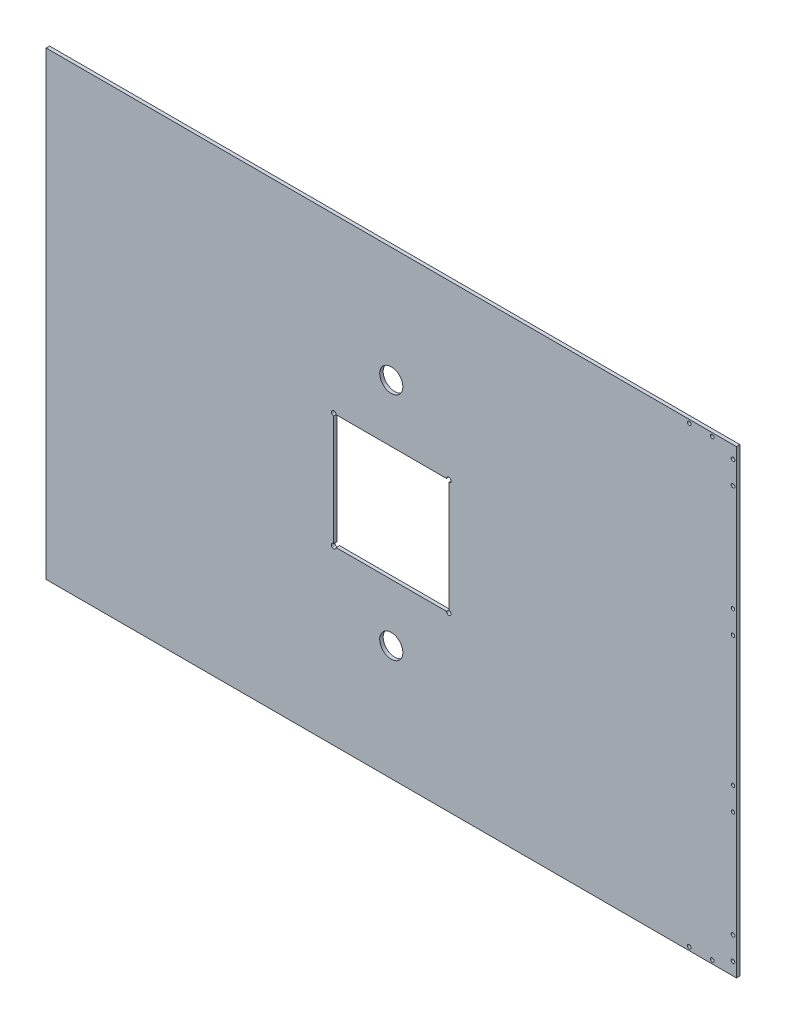
ISO-10303-21;
HEADER;
FILE_DESCRIPTION(('STEP AP214'),'2;1');
FILE_NAME('part.step','',(''),(''),'','','');
FILE_SCHEMA(('AUTOMOTIVE_DESIGN { 1 0 10303 214 1 1 1 1 }'));
ENDSEC;
DATA;
#1=APPLICATION_CONTEXT('core data for automotive mechanical design processes');
#2=APPLICATION_PROTOCOL_DEFINITION('international standard','automotive_design',2000,#1);
#3=PRODUCT_CONTEXT('',#1,'mechanical');
#4=PRODUCT('Part','Part','',(#3));
#5=PRODUCT_RELATED_PRODUCT_CATEGORY('part','',(#4));
#6=PRODUCT_DEFINITION_FORMATION('','',#4);
#7=PRODUCT_DEFINITION_CONTEXT('part definition',#1,'design');
#8=PRODUCT_DEFINITION('design','',#6,#7);
#9=PRODUCT_DEFINITION_SHAPE('','',#8);
#10=(LENGTH_UNIT() NAMED_UNIT(*) SI_UNIT(.MILLI.,.METRE.));
#11=(NAMED_UNIT(*) PLANE_ANGLE_UNIT() SI_UNIT($,.RADIAN.));
#12=(NAMED_UNIT(*) SI_UNIT($,.STERADIAN.) SOLID_ANGLE_UNIT());
#13=UNCERTAINTY_MEASURE_WITH_UNIT(LENGTH_MEASURE(1.E-05),#10,'distance_accuracy_value','');
#14=(GEOMETRIC_REPRESENTATION_CONTEXT(3) GLOBAL_UNCERTAINTY_ASSIGNED_CONTEXT((#13)) GLOBAL_UNIT_ASSIGNED_CONTEXT((#10,
#11,#12)) REPRESENTATION_CONTEXT('',''));
#15=CARTESIAN_POINT('',(0.,0.,0.));
#16=DIRECTION('',(0.,0.,1.));
#17=DIRECTION('',(1.,0.,0.));
#18=AXIS2_PLACEMENT_3D('',#15,#16,#17);
#19=CARTESIAN_POINT('',(300.,200.,3.));
#20=DIRECTION('',(-1.,0.,0.));
#21=DIRECTION('',(0.,0.,1.));
#22=AXIS2_PLACEMENT_3D('',#19,#20,#21);
#23=PLANE('',#22);
#24=DIRECTION('',(0.,1.,0.));
#25=VECTOR('',#24,1.);
#26=CARTESIAN_POINT('',(300.,200.,0.));
#27=LINE('',#26,#25);
#28=CARTESIAN_POINT('',(300.,-200.,0.));
#29=VERTEX_POINT('',#28);
#30=CARTESIAN_POINT('',(300.,200.,0.));
#31=VERTEX_POINT('',#30);
#32=EDGE_CURVE('E181',#29,#31,#27,.T.);
#33=ORIENTED_EDGE('',*,*,#32,.T.);
#34=DIRECTION('',(0.,0.,-1.));
#35=VECTOR('',#34,1.);
#36=CARTESIAN_POINT('',(300.,200.,3.));
#37=LINE('',#36,#35);
#38=CARTESIAN_POINT('',(300.,200.,3.));
#39=VERTEX_POINT('',#38);
#40=EDGE_CURVE('E199',#39,#31,#37,.T.);
#41=ORIENTED_EDGE('',*,*,#40,.F.);
#42=DIRECTION('',(0.,1.,0.));
#43=VECTOR('',#42,1.);
#44=CARTESIAN_POINT('',(300.,200.,3.));
#45=LINE('',#44,#43);
#46=CARTESIAN_POINT('',(300.,-200.,3.));
#47=VERTEX_POINT('',#46);
#48=EDGE_CURVE('E167',#47,#39,#45,.T.);
#49=ORIENTED_EDGE('',*,*,#48,.F.);
#50=DIRECTION('',(0.,0.,-1.));
#51=VECTOR('',#50,1.);
#52=CARTESIAN_POINT('',(300.,-200.,3.));
#53=LINE('',#52,#51);
#54=EDGE_CURVE('E179',#47,#29,#53,.T.);
#55=ORIENTED_EDGE('',*,*,#54,.T.);
#56=EDGE_LOOP('',(#33,#41,#49,#55));
#57=FACE_BOUND('',#56,.T.);
#58=ADVANCED_FACE('F41',(#57),#23,.F.);
#59=CARTESIAN_POINT('',(-300.,200.,3.));
#60=DIRECTION('',(0.,-1.,0.));
#61=DIRECTION('',(0.,0.,-1.));
#62=AXIS2_PLACEMENT_3D('',#59,#60,#61);
#63=PLANE('',#62);
#64=DIRECTION('',(-1.,0.,0.));
#65=VECTOR('',#64,1.);
#66=CARTESIAN_POINT('',(-300.,200.,0.));
#67=LINE('',#66,#65);
#68=CARTESIAN_POINT('',(-300.,200.,0.));
#69=VERTEX_POINT('',#68);
#70=EDGE_CURVE('E183',#31,#69,#67,.T.);
#71=ORIENTED_EDGE('',*,*,#70,.T.);
#72=DIRECTION('',(0.,0.,-1.));
#73=VECTOR('',#72,1.);
#74=CARTESIAN_POINT('',(-300.,200.,3.));
#75=LINE('',#74,#73);
#76=CARTESIAN_POINT('',(-300.,200.,3.));
#77=VERTEX_POINT('',#76);
#78=EDGE_CURVE('E191',#77,#69,#75,.T.);
#79=ORIENTED_EDGE('',*,*,#78,.F.);
#80=DIRECTION('',(-1.,0.,0.));
#81=VECTOR('',#80,1.);
#82=CARTESIAN_POINT('',(-300.,200.,3.));
#83=LINE('',#82,#81);
#84=EDGE_CURVE('E173',#39,#77,#83,.T.);
#85=ORIENTED_EDGE('',*,*,#84,.F.);
#86=ORIENTED_EDGE('',*,*,#40,.T.);
#87=EDGE_LOOP('',(#71,#79,#85,#86));
#88=FACE_BOUND('',#87,.T.);
#89=ADVANCED_FACE('F380',(#88),#63,.F.);
#90=CARTESIAN_POINT('',(-300.,200.,3.));
#91=DIRECTION('',(1.,0.,0.));
#92=DIRECTION('',(0.,1.,0.));
#93=AXIS2_PLACEMENT_3D('',#90,#91,#92);
#94=PLANE('',#93);
#95=DIRECTION('',(0.,-1.,0.));
#96=VECTOR('',#95,1.);
#97=CARTESIAN_POINT('',(-300.,200.,0.));
#98=LINE('',#97,#96);
#99=CARTESIAN_POINT('',(-300.,-200.,0.));
#100=VERTEX_POINT('',#99);
#101=EDGE_CURVE('E187',#69,#100,#98,.T.);
#102=ORIENTED_EDGE('',*,*,#101,.T.);
#103=DIRECTION('',(0.,0.,-1.));
#104=VECTOR('',#103,1.);
#105=CARTESIAN_POINT('',(-300.,-200.,3.));
#106=LINE('',#105,#104);
#107=CARTESIAN_POINT('',(-300.,-200.,3.));
#108=VERTEX_POINT('',#107);
#109=EDGE_CURVE('E192',#108,#100,#106,.T.);
#110=ORIENTED_EDGE('',*,*,#109,.F.);
#111=DIRECTION('',(0.,-1.,0.));
#112=VECTOR('',#111,1.);
#113=CARTESIAN_POINT('',(-300.,200.,3.));
#114=LINE('',#113,#112);
#115=EDGE_CURVE('E176',#77,#108,#114,.T.);
#116=ORIENTED_EDGE('',*,*,#115,.F.);
#117=ORIENTED_EDGE('',*,*,#78,.T.);
#118=EDGE_LOOP('',(#102,#110,#116,#117));
#119=FACE_BOUND('',#118,.T.);
#120=ADVANCED_FACE('F385',(#119),#94,.F.);
#121=CARTESIAN_POINT('',(-300.,-200.,3.));
#122=DIRECTION('',(0.,1.,0.));
#123=DIRECTION('',(0.,0.,1.));
#124=AXIS2_PLACEMENT_3D('',#121,#122,#123);
#125=PLANE('',#124);
#126=DIRECTION('',(1.,0.,0.));
#127=VECTOR('',#126,1.);
#128=CARTESIAN_POINT('',(-300.,-200.,0.));
#129=LINE('',#128,#127);
#130=EDGE_CURVE('E172',#100,#29,#129,.T.);
#131=ORIENTED_EDGE('',*,*,#130,.T.);
#132=ORIENTED_EDGE('',*,*,#54,.F.);
#133=DIRECTION('',(1.,0.,0.));
#134=VECTOR('',#133,1.);
#135=CARTESIAN_POINT('',(-300.,-200.,3.));
#136=LINE('',#135,#134);
#137=EDGE_CURVE('E178',#108,#47,#136,.T.);
#138=ORIENTED_EDGE('',*,*,#137,.F.);
#139=ORIENTED_EDGE('',*,*,#109,.T.);
#140=EDGE_LOOP('',(#131,#132,#138,#139));
#141=FACE_BOUND('',#140,.T.);
#142=ADVANCED_FACE('F393',(#141),#125,.F.);
#143=CARTESIAN_POINT('',(0.,0.,3.));
#144=DIRECTION('',(0.,0.,1.));
#145=DIRECTION('',(1.,0.,0.));
#146=AXIS2_PLACEMENT_3D('',#143,#144,#145);
#147=PLANE('',#146);
#148=CARTESIAN_POINT('',(297.,76.5,3.));
#149=DIRECTION('',(0.,0.,-1.));
#150=DIRECTION('',(1.,0.,0.));
#151=AXIS2_PLACEMENT_3D('',#148,#149,#150);
#152=CIRCLE('',#151,1.50000000000002);
#153=CARTESIAN_POINT('',(298.5,76.5,3.));
#154=VERTEX_POINT('',#153);
#155=EDGE_CURVE('E287',#154,#154,#152,.T.);
#156=ORIENTED_EDGE('',*,*,#155,.T.);
#157=EDGE_LOOP('',(#156));
#158=FACE_BOUND('',#157,.T.);
#159=CARTESIAN_POINT('',(297.,56.5,3.));
#160=DIRECTION('',(0.,0.,-1.));
#161=DIRECTION('',(1.,0.,0.));
#162=AXIS2_PLACEMENT_3D('',#159,#160,#161);
#163=CIRCLE('',#162,1.50000000000002);
#164=CARTESIAN_POINT('',(298.5,56.5,3.));
#165=VERTEX_POINT('',#164);
#166=EDGE_CURVE('E307',#165,#165,#163,.T.);
#167=ORIENTED_EDGE('',*,*,#166,.T.);
#168=EDGE_LOOP('',(#167));
#169=FACE_BOUND('',#168,.T.);
#170=CARTESIAN_POINT('',(297.,-56.5,3.));
#171=DIRECTION('',(0.,0.,-1.));
#172=DIRECTION('',(-1.,0.,0.));
#173=AXIS2_PLACEMENT_3D('',#170,#171,#172);
#174=CIRCLE('',#173,1.50000000000002);
#175=CARTESIAN_POINT('',(295.5,-56.5,3.));
#176=VERTEX_POINT('',#175);
#177=EDGE_CURVE('E303',#176,#176,#174,.T.);
#178=ORIENTED_EDGE('',*,*,#177,.T.);
#179=EDGE_LOOP('',(#178));
#180=FACE_BOUND('',#179,.T.);
#181=CARTESIAN_POINT('',(297.,-76.5,3.));
#182=DIRECTION('',(0.,0.,-1.));
#183=DIRECTION('',(-1.,0.,0.));
#184=AXIS2_PLACEMENT_3D('',#181,#182,#183);
#185=CIRCLE('',#184,1.50000000000002);
#186=CARTESIAN_POINT('',(295.5,-76.5,3.));
#187=VERTEX_POINT('',#186);
#188=EDGE_CURVE('E300',#187,#187,#185,.T.);
#189=ORIENTED_EDGE('',*,*,#188,.T.);
#190=EDGE_LOOP('',(#189));
#191=FACE_BOUND('',#190,.T.);
#192=CARTESIAN_POINT('',(0.,100.,3.));
#193=DIRECTION('',(0.,0.,-1.));
#194=DIRECTION('',(-1.,0.,0.));
#195=AXIS2_PLACEMENT_3D('',#192,#193,#194);
#196=CIRCLE('',#195,10.05);
#197=CARTESIAN_POINT('',(-10.05,100.,3.));
#198=VERTEX_POINT('',#197);
#199=EDGE_CURVE('E272',#198,#198,#196,.T.);
#200=ORIENTED_EDGE('',*,*,#199,.T.);
#201=EDGE_LOOP('',(#200));
#202=FACE_BOUND('',#201,.T.);
#203=CARTESIAN_POINT('',(0.,-100.,3.));
#204=DIRECTION('',(0.,0.,-1.));
#205=DIRECTION('',(1.,0.,0.));
#206=AXIS2_PLACEMENT_3D('',#203,#204,#205);
#207=CIRCLE('',#206,10.05);
#208=CARTESIAN_POINT('',(10.05,-100.,3.));
#209=VERTEX_POINT('',#208);
#210=EDGE_CURVE('E283',#209,#209,#207,.T.);
#211=ORIENTED_EDGE('',*,*,#210,.T.);
#212=EDGE_LOOP('',(#211));
#213=FACE_BOUND('',#212,.T.);
#214=CARTESIAN_POINT('',(279.,-197.,3.));
#215=DIRECTION('',(0.,0.,-1.));
#216=DIRECTION('',(1.,0.,0.));
#217=AXIS2_PLACEMENT_3D('',#214,#215,#216);
#218=CIRCLE('',#217,1.60000000000002);
#219=CARTESIAN_POINT('',(280.6,-197.,3.));
#220=VERTEX_POINT('',#219);
#221=EDGE_CURVE('E264',#220,#220,#218,.T.);
#222=ORIENTED_EDGE('',*,*,#221,.T.);
#223=EDGE_LOOP('',(#222));
#224=FACE_BOUND('',#223,.T.);
#225=CARTESIAN_POINT('',(297.,-189.,3.));
#226=DIRECTION('',(0.,0.,-1.));
#227=DIRECTION('',(1.,0.,0.));
#228=AXIS2_PLACEMENT_3D('',#225,#226,#227);
#229=CIRCLE('',#228,1.60000000000002);
#230=CARTESIAN_POINT('',(298.6,-189.,3.));
#231=VERTEX_POINT('',#230);
#232=EDGE_CURVE('E257',#231,#231,#229,.T.);
#233=ORIENTED_EDGE('',*,*,#232,.T.);
#234=EDGE_LOOP('',(#233));
#235=FACE_BOUND('',#234,.T.);
#236=CARTESIAN_POINT('',(297.,169.,3.));
#237=DIRECTION('',(0.,0.,-1.));
#238=DIRECTION('',(-1.,0.,0.));
#239=AXIS2_PLACEMENT_3D('',#236,#237,#238);
#240=CIRCLE('',#239,1.59999999999996);
#241=CARTESIAN_POINT('',(295.4,169.,3.));
#242=VERTEX_POINT('',#241);
#243=EDGE_CURVE('E249',#242,#242,#240,.T.);
#244=ORIENTED_EDGE('',*,*,#243,.T.);
#245=EDGE_LOOP('',(#244));
#246=FACE_BOUND('',#245,.T.);
#247=CARTESIAN_POINT('',(297.,189.,3.));
#248=DIRECTION('',(0.,0.,-1.));
#249=DIRECTION('',(-1.,0.,0.));
#250=AXIS2_PLACEMENT_3D('',#247,#248,#249);
#251=CIRCLE('',#250,1.60000000000002);
#252=CARTESIAN_POINT('',(295.4,189.,3.));
#253=VERTEX_POINT('',#252);
#254=EDGE_CURVE('E243',#253,#253,#251,.T.);
#255=ORIENTED_EDGE('',*,*,#254,.T.);
#256=EDGE_LOOP('',(#255));
#257=FACE_BOUND('',#256,.T.);
#258=CARTESIAN_POINT('',(279.,197.,3.));
#259=DIRECTION('',(0.,0.,-1.));
#260=DIRECTION('',(-1.,0.,0.));
#261=AXIS2_PLACEMENT_3D('',#258,#259,#260);
#262=CIRCLE('',#261,1.60000000000002);
#263=CARTESIAN_POINT('',(277.4,197.,3.));
#264=VERTEX_POINT('',#263);
#265=EDGE_CURVE('E278',#264,#264,#262,.T.);
#266=ORIENTED_EDGE('',*,*,#265,.T.);
#267=EDGE_LOOP('',(#266));
#268=FACE_BOUND('',#267,.T.);
#269=CARTESIAN_POINT('',(259.,197.,3.));
#270=DIRECTION('',(0.,0.,-1.));
#271=DIRECTION('',(-1.,0.,0.));
#272=AXIS2_PLACEMENT_3D('',#269,#270,#271);
#273=CIRCLE('',#272,1.60000000000002);
#274=CARTESIAN_POINT('',(257.4,197.,3.));
#275=VERTEX_POINT('',#274);
#276=EDGE_CURVE('E274',#275,#275,#273,.T.);
#277=ORIENTED_EDGE('',*,*,#276,.T.);
#278=EDGE_LOOP('',(#277));
#279=FACE_BOUND('',#278,.T.);
#280=CARTESIAN_POINT('',(297.,-169.,3.));
#281=DIRECTION('',(0.,0.,-1.));
#282=DIRECTION('',(1.,0.,0.));
#283=AXIS2_PLACEMENT_3D('',#280,#281,#282);
#284=CIRCLE('',#283,1.59999999999996);
#285=CARTESIAN_POINT('',(298.6,-169.,3.));
#286=VERTEX_POINT('',#285);
#287=EDGE_CURVE('E270',#286,#286,#284,.T.);
#288=ORIENTED_EDGE('',*,*,#287,.T.);
#289=EDGE_LOOP('',(#288));
#290=FACE_BOUND('',#289,.T.);
#291=CARTESIAN_POINT('',(259.,-197.,3.));
#292=DIRECTION('',(0.,0.,-1.));
#293=DIRECTION('',(1.,0.,0.));
#294=AXIS2_PLACEMENT_3D('',#291,#292,#293);
#295=CIRCLE('',#294,1.60000000000002);
#296=CARTESIAN_POINT('',(260.6,-197.,3.));
#297=VERTEX_POINT('',#296);
#298=EDGE_CURVE('E230',#297,#297,#295,.T.);
#299=ORIENTED_EDGE('',*,*,#298,.T.);
#300=EDGE_LOOP('',(#299));
#301=FACE_BOUND('',#300,.T.);
#302=CARTESIAN_POINT('',(50.,50.,3.));
#303=DIRECTION('',(0.,0.,1.));
#304=DIRECTION('',(1.,0.,0.));
#305=AXIS2_PLACEMENT_3D('',#302,#303,#304);
#306=CIRCLE('',#305,2.);
#307=CARTESIAN_POINT('',(50.,48.,3.));
#308=VERTEX_POINT('',#307);
#309=CARTESIAN_POINT('',(48.,50.,3.));
#310=VERTEX_POINT('',#309);
#311=EDGE_CURVE('E220',#308,#310,#306,.T.);
#312=ORIENTED_EDGE('',*,*,#311,.F.);
#313=DIRECTION('',(0.,-1.,0.));
#314=VECTOR('',#313,1.);
#315=CARTESIAN_POINT('',(50.,50.,3.));
#316=LINE('',#315,#314);
#317=CARTESIAN_POINT('',(50.,-48.,3.));
#318=VERTEX_POINT('',#317);
#319=EDGE_CURVE('E209',#308,#318,#316,.T.);
#320=ORIENTED_EDGE('',*,*,#319,.T.);
#321=CARTESIAN_POINT('',(50.,-50.,3.));
#322=DIRECTION('',(0.,0.,1.));
#323=DIRECTION('',(1.,0.,0.));
#324=AXIS2_PLACEMENT_3D('',#321,#322,#323);
#325=CIRCLE('',#324,2.);
#326=CARTESIAN_POINT('',(48.,-50.,3.));
#327=VERTEX_POINT('',#326);
#328=EDGE_CURVE('E65',#327,#318,#325,.T.);
#329=ORIENTED_EDGE('',*,*,#328,.F.);
#330=DIRECTION('',(-1.,0.,0.));
#331=VECTOR('',#330,1.);
#332=CARTESIAN_POINT('',(50.,-50.,3.));
#333=LINE('',#332,#331);
#334=CARTESIAN_POINT('',(-48.,-50.,3.));
#335=VERTEX_POINT('',#334);
#336=EDGE_CURVE('E163',#327,#335,#333,.T.);
#337=ORIENTED_EDGE('',*,*,#336,.T.);
#338=CARTESIAN_POINT('',(-50.,-50.,3.));
#339=DIRECTION('',(0.,0.,1.));
#340=DIRECTION('',(1.,0.,0.));
#341=AXIS2_PLACEMENT_3D('',#338,#339,#340);
#342=CIRCLE('',#341,2.);
#343=CARTESIAN_POINT('',(-50.,-48.,3.));
#344=VERTEX_POINT('',#343);
#345=EDGE_CURVE('E54',#344,#335,#342,.T.);
#346=ORIENTED_EDGE('',*,*,#345,.F.);
#347=DIRECTION('',(0.,1.,0.));
#348=VECTOR('',#347,1.);
#349=CARTESIAN_POINT('',(-50.,50.,3.));
#350=LINE('',#349,#348);
#351=CARTESIAN_POINT('',(-50.,48.,3.));
#352=VERTEX_POINT('',#351);
#353=EDGE_CURVE('E169',#344,#352,#350,.T.);
#354=ORIENTED_EDGE('',*,*,#353,.T.);
#355=CARTESIAN_POINT('',(-50.,50.,3.));
#356=DIRECTION('',(0.,0.,1.));
#357=DIRECTION('',(1.,0.,0.));
#358=AXIS2_PLACEMENT_3D('',#355,#356,#357);
#359=CIRCLE('',#358,2.);
#360=CARTESIAN_POINT('',(-48.,50.,3.));
#361=VERTEX_POINT('',#360);
#362=EDGE_CURVE('E135',#361,#352,#359,.T.);
#363=ORIENTED_EDGE('',*,*,#362,.F.);
#364=DIRECTION('',(1.,0.,0.));
#365=VECTOR('',#364,1.);
#366=CARTESIAN_POINT('',(50.,50.,3.));
#367=LINE('',#366,#365);
#368=EDGE_CURVE('E216',#361,#310,#367,.T.);
#369=ORIENTED_EDGE('',*,*,#368,.T.);
#370=EDGE_LOOP('',(#312,#320,#329,#337,#346,#354,#363,#369));
#371=FACE_BOUND('',#370,.T.);
#372=ORIENTED_EDGE('',*,*,#48,.T.);
#373=ORIENTED_EDGE('',*,*,#84,.T.);
#374=ORIENTED_EDGE('',*,*,#115,.T.);
#375=ORIENTED_EDGE('',*,*,#137,.T.);
#376=EDGE_LOOP('',(#372,#373,#374,#375));
#377=FACE_BOUND('',#376,.T.);
#378=ADVANCED_FACE('F214',(#158,#169,#180,#191,#202,#213,#224,#235,#246,#257,#268,#279,#290,
#301,#371,#377),#147,.T.);
#379=CARTESIAN_POINT('',(0.,0.,0.));
#380=DIRECTION('',(0.,0.,1.));
#381=DIRECTION('',(1.,0.,0.));
#382=AXIS2_PLACEMENT_3D('',#379,#380,#381);
#383=PLANE('',#382);
#384=CARTESIAN_POINT('',(297.,76.5,0.));
#385=DIRECTION('',(0.,0.,-1.));
#386=DIRECTION('',(1.,0.,0.));
#387=AXIS2_PLACEMENT_3D('',#384,#385,#386);
#388=CIRCLE('',#387,1.50000000000002);
#389=CARTESIAN_POINT('',(298.5,76.5,0.));
#390=VERTEX_POINT('',#389);
#391=EDGE_CURVE('E314',#390,#390,#388,.T.);
#392=ORIENTED_EDGE('',*,*,#391,.F.);
#393=EDGE_LOOP('',(#392));
#394=FACE_BOUND('',#393,.T.);
#395=CARTESIAN_POINT('',(297.,56.5,0.));
#396=DIRECTION('',(0.,0.,-1.));
#397=DIRECTION('',(1.,0.,0.));
#398=AXIS2_PLACEMENT_3D('',#395,#396,#397);
#399=CIRCLE('',#398,1.50000000000002);
#400=CARTESIAN_POINT('',(298.5,56.5,0.));
#401=VERTEX_POINT('',#400);
#402=EDGE_CURVE('E315',#401,#401,#399,.T.);
#403=ORIENTED_EDGE('',*,*,#402,.F.);
#404=EDGE_LOOP('',(#403));
#405=FACE_BOUND('',#404,.T.);
#406=CARTESIAN_POINT('',(297.,-56.5,0.));
#407=DIRECTION('',(0.,0.,-1.));
#408=DIRECTION('',(-1.,0.,0.));
#409=AXIS2_PLACEMENT_3D('',#406,#407,#408);
#410=CIRCLE('',#409,1.50000000000002);
#411=CARTESIAN_POINT('',(295.5,-56.5,0.));
#412=VERTEX_POINT('',#411);
#413=EDGE_CURVE('E306',#412,#412,#410,.T.);
#414=ORIENTED_EDGE('',*,*,#413,.F.);
#415=EDGE_LOOP('',(#414));
#416=FACE_BOUND('',#415,.T.);
#417=CARTESIAN_POINT('',(297.,-76.5,0.));
#418=DIRECTION('',(0.,0.,-1.));
#419=DIRECTION('',(-1.,0.,0.));
#420=AXIS2_PLACEMENT_3D('',#417,#418,#419);
#421=CIRCLE('',#420,1.50000000000002);
#422=CARTESIAN_POINT('',(295.5,-76.5,0.));
#423=VERTEX_POINT('',#422);
#424=EDGE_CURVE('E297',#423,#423,#421,.T.);
#425=ORIENTED_EDGE('',*,*,#424,.F.);
#426=EDGE_LOOP('',(#425));
#427=FACE_BOUND('',#426,.T.);
#428=CARTESIAN_POINT('',(0.,100.,0.));
#429=DIRECTION('',(0.,0.,-1.));
#430=DIRECTION('',(-1.,0.,0.));
#431=AXIS2_PLACEMENT_3D('',#428,#429,#430);
#432=CIRCLE('',#431,10.05);
#433=CARTESIAN_POINT('',(-10.05,100.,0.));
#434=VERTEX_POINT('',#433);
#435=EDGE_CURVE('E292',#434,#434,#432,.T.);
#436=ORIENTED_EDGE('',*,*,#435,.F.);
#437=EDGE_LOOP('',(#436));
#438=FACE_BOUND('',#437,.T.);
#439=CARTESIAN_POINT('',(0.,-100.,0.));
#440=DIRECTION('',(0.,0.,-1.));
#441=DIRECTION('',(1.,0.,0.));
#442=AXIS2_PLACEMENT_3D('',#439,#440,#441);
#443=CIRCLE('',#442,10.05);
#444=CARTESIAN_POINT('',(10.05,-100.,0.));
#445=VERTEX_POINT('',#444);
#446=EDGE_CURVE('E286',#445,#445,#443,.T.);
#447=ORIENTED_EDGE('',*,*,#446,.F.);
#448=EDGE_LOOP('',(#447));
#449=FACE_BOUND('',#448,.T.);
#450=CARTESIAN_POINT('',(279.,-197.,0.));
#451=DIRECTION('',(0.,0.,-1.));
#452=DIRECTION('',(1.,0.,0.));
#453=AXIS2_PLACEMENT_3D('',#450,#451,#452);
#454=CIRCLE('',#453,1.60000000000002);
#455=CARTESIAN_POINT('',(280.6,-197.,0.));
#456=VERTEX_POINT('',#455);
#457=EDGE_CURVE('E239',#456,#456,#454,.T.);
#458=ORIENTED_EDGE('',*,*,#457,.F.);
#459=EDGE_LOOP('',(#458));
#460=FACE_BOUND('',#459,.T.);
#461=CARTESIAN_POINT('',(297.,-189.,0.));
#462=DIRECTION('',(0.,0.,-1.));
#463=DIRECTION('',(1.,0.,0.));
#464=AXIS2_PLACEMENT_3D('',#461,#462,#463);
#465=CIRCLE('',#464,1.60000000000002);
#466=CARTESIAN_POINT('',(298.6,-189.,0.));
#467=VERTEX_POINT('',#466);
#468=EDGE_CURVE('E256',#467,#467,#465,.T.);
#469=ORIENTED_EDGE('',*,*,#468,.F.);
#470=EDGE_LOOP('',(#469));
#471=FACE_BOUND('',#470,.T.);
#472=CARTESIAN_POINT('',(297.,169.,0.));
#473=DIRECTION('',(0.,0.,-1.));
#474=DIRECTION('',(-1.,0.,0.));
#475=AXIS2_PLACEMENT_3D('',#472,#473,#474);
#476=CIRCLE('',#475,1.59999999999996);
#477=CARTESIAN_POINT('',(295.4,169.,0.));
#478=VERTEX_POINT('',#477);
#479=EDGE_CURVE('E254',#478,#478,#476,.T.);
#480=ORIENTED_EDGE('',*,*,#479,.F.);
#481=EDGE_LOOP('',(#480));
#482=FACE_BOUND('',#481,.T.);
#483=CARTESIAN_POINT('',(297.,189.,0.));
#484=DIRECTION('',(0.,0.,-1.));
#485=DIRECTION('',(-1.,0.,0.));
#486=AXIS2_PLACEMENT_3D('',#483,#484,#485);
#487=CIRCLE('',#486,1.60000000000002);
#488=CARTESIAN_POINT('',(295.4,189.,0.));
#489=VERTEX_POINT('',#488);
#490=EDGE_CURVE('E246',#489,#489,#487,.T.);
#491=ORIENTED_EDGE('',*,*,#490,.F.);
#492=EDGE_LOOP('',(#491));
#493=FACE_BOUND('',#492,.T.);
#494=CARTESIAN_POINT('',(279.,197.,0.));
#495=DIRECTION('',(0.,0.,-1.));
#496=DIRECTION('',(-1.,0.,0.));
#497=AXIS2_PLACEMENT_3D('',#494,#495,#496);
#498=CIRCLE('',#497,1.60000000000002);
#499=CARTESIAN_POINT('',(277.4,197.,0.));
#500=VERTEX_POINT('',#499);
#501=EDGE_CURVE('E250',#500,#500,#498,.T.);
#502=ORIENTED_EDGE('',*,*,#501,.F.);
#503=EDGE_LOOP('',(#502));
#504=FACE_BOUND('',#503,.T.);
#505=CARTESIAN_POINT('',(259.,197.,0.));
#506=DIRECTION('',(0.,0.,-1.));
#507=DIRECTION('',(-1.,0.,0.));
#508=AXIS2_PLACEMENT_3D('',#505,#506,#507);
#509=CIRCLE('',#508,1.60000000000002);
#510=CARTESIAN_POINT('',(257.4,197.,0.));
#511=VERTEX_POINT('',#510);
#512=EDGE_CURVE('E280',#511,#511,#509,.T.);
#513=ORIENTED_EDGE('',*,*,#512,.F.);
#514=EDGE_LOOP('',(#513));
#515=FACE_BOUND('',#514,.T.);
#516=CARTESIAN_POINT('',(297.,-169.,0.));
#517=DIRECTION('',(0.,0.,-1.));
#518=DIRECTION('',(1.,0.,0.));
#519=AXIS2_PLACEMENT_3D('',#516,#517,#518);
#520=CIRCLE('',#519,1.59999999999996);
#521=CARTESIAN_POINT('',(298.6,-169.,0.));
#522=VERTEX_POINT('',#521);
#523=EDGE_CURVE('E269',#522,#522,#520,.T.);
#524=ORIENTED_EDGE('',*,*,#523,.F.);
#525=EDGE_LOOP('',(#524));
#526=FACE_BOUND('',#525,.T.);
#527=CARTESIAN_POINT('',(259.,-197.,0.));
#528=DIRECTION('',(0.,0.,-1.));
#529=DIRECTION('',(1.,0.,0.));
#530=AXIS2_PLACEMENT_3D('',#527,#528,#529);
#531=CIRCLE('',#530,1.60000000000002);
#532=CARTESIAN_POINT('',(260.6,-197.,0.));
#533=VERTEX_POINT('',#532);
#534=EDGE_CURVE('E240',#533,#533,#531,.T.);
#535=ORIENTED_EDGE('',*,*,#534,.F.);
#536=EDGE_LOOP('',(#535));
#537=FACE_BOUND('',#536,.T.);
#538=DIRECTION('',(0.,-1.,0.));
#539=VECTOR('',#538,1.);
#540=CARTESIAN_POINT('',(50.,50.,0.));
#541=LINE('',#540,#539);
#542=CARTESIAN_POINT('',(50.,48.,0.));
#543=VERTEX_POINT('',#542);
#544=CARTESIAN_POINT('',(50.,-48.,0.));
#545=VERTEX_POINT('',#544);
#546=EDGE_CURVE('E158',#543,#545,#541,.T.);
#547=ORIENTED_EDGE('',*,*,#546,.F.);
#548=CARTESIAN_POINT('',(50.,50.,0.));
#549=DIRECTION('',(0.,0.,1.));
#550=DIRECTION('',(1.,0.,0.));
#551=AXIS2_PLACEMENT_3D('',#548,#549,#550);
#552=CIRCLE('',#551,2.);
#553=CARTESIAN_POINT('',(48.,50.,0.));
#554=VERTEX_POINT('',#553);
#555=EDGE_CURVE('E227',#543,#554,#552,.T.);
#556=ORIENTED_EDGE('',*,*,#555,.T.);
#557=DIRECTION('',(1.,0.,0.));
#558=VECTOR('',#557,1.);
#559=CARTESIAN_POINT('',(50.,50.,0.));
#560=LINE('',#559,#558);
#561=CARTESIAN_POINT('',(-48.,50.,0.));
#562=VERTEX_POINT('',#561);
#563=EDGE_CURVE('E148',#562,#554,#560,.T.);
#564=ORIENTED_EDGE('',*,*,#563,.F.);
#565=CARTESIAN_POINT('',(-50.,50.,0.));
#566=DIRECTION('',(0.,0.,1.));
#567=DIRECTION('',(1.,0.,0.));
#568=AXIS2_PLACEMENT_3D('',#565,#566,#567);
#569=CIRCLE('',#568,2.);
#570=CARTESIAN_POINT('',(-50.,48.,0.));
#571=VERTEX_POINT('',#570);
#572=EDGE_CURVE('E128',#562,#571,#569,.T.);
#573=ORIENTED_EDGE('',*,*,#572,.T.);
#574=DIRECTION('',(0.,1.,0.));
#575=VECTOR('',#574,1.);
#576=CARTESIAN_POINT('',(-50.,50.,0.));
#577=LINE('',#576,#575);
#578=CARTESIAN_POINT('',(-50.,-48.,0.));
#579=VERTEX_POINT('',#578);
#580=EDGE_CURVE('E150',#579,#571,#577,.T.);
#581=ORIENTED_EDGE('',*,*,#580,.F.);
#582=CARTESIAN_POINT('',(-50.,-50.,0.));
#583=DIRECTION('',(0.,0.,1.));
#584=DIRECTION('',(1.,0.,0.));
#585=AXIS2_PLACEMENT_3D('',#582,#583,#584);
#586=CIRCLE('',#585,2.);
#587=CARTESIAN_POINT('',(-48.,-50.,0.));
#588=VERTEX_POINT('',#587);
#589=EDGE_CURVE('E234',#579,#588,#586,.T.);
#590=ORIENTED_EDGE('',*,*,#589,.T.);
#591=DIRECTION('',(-1.,0.,0.));
#592=VECTOR('',#591,1.);
#593=CARTESIAN_POINT('',(50.,-50.,0.));
#594=LINE('',#593,#592);
#595=CARTESIAN_POINT('',(48.,-50.,0.));
#596=VERTEX_POINT('',#595);
#597=EDGE_CURVE('E168',#596,#588,#594,.T.);
#598=ORIENTED_EDGE('',*,*,#597,.F.);
#599=CARTESIAN_POINT('',(50.,-50.,0.));
#600=DIRECTION('',(0.,0.,1.));
#601=DIRECTION('',(1.,0.,0.));
#602=AXIS2_PLACEMENT_3D('',#599,#600,#601);
#603=CIRCLE('',#602,2.);
#604=EDGE_CURVE('E233',#596,#545,#603,.T.);
#605=ORIENTED_EDGE('',*,*,#604,.T.);
#606=EDGE_LOOP('',(#547,#556,#564,#573,#581,#590,#598,#605));
#607=FACE_BOUND('',#606,.T.);
#608=ORIENTED_EDGE('',*,*,#32,.F.);
#609=ORIENTED_EDGE('',*,*,#130,.F.);
#610=ORIENTED_EDGE('',*,*,#101,.F.);
#611=ORIENTED_EDGE('',*,*,#70,.F.);
#612=EDGE_LOOP('',(#608,#609,#610,#611));
#613=FACE_BOUND('',#612,.T.);
#614=ADVANCED_FACE('F144',(#394,#405,#416,#427,#438,#449,#460,#471,#482,#493,#504,#515,#526,
#537,#607,#613),#383,.F.);
#615=CARTESIAN_POINT('',(-50.,50.,3.));
#616=DIRECTION('',(-1.,0.,0.));
#617=DIRECTION('',(0.,-1.,0.));
#618=AXIS2_PLACEMENT_3D('',#615,#616,#617);
#619=PLANE('',#618);
#620=ORIENTED_EDGE('',*,*,#353,.F.);
#621=DIRECTION('',(0.,0.,1.));
#622=VECTOR('',#621,1.);
#623=CARTESIAN_POINT('',(-50.,-48.,0.));
#624=LINE('',#623,#622);
#625=EDGE_CURVE('E151',#344,#579,#624,.F.);
#626=ORIENTED_EDGE('',*,*,#625,.T.);
#627=ORIENTED_EDGE('',*,*,#580,.T.);
#628=DIRECTION('',(0.,0.,1.));
#629=VECTOR('',#628,1.);
#630=CARTESIAN_POINT('',(-50.,48.,0.));
#631=LINE('',#630,#629);
#632=EDGE_CURVE('E130',#571,#352,#631,.T.);
#633=ORIENTED_EDGE('',*,*,#632,.T.);
#634=EDGE_LOOP('',(#620,#626,#627,#633));
#635=FACE_BOUND('',#634,.T.);
#636=ADVANCED_FACE('F155',(#635),#619,.F.);
#637=CARTESIAN_POINT('',(50.,-50.,3.));
#638=DIRECTION('',(0.,-1.,0.));
#639=DIRECTION('',(1.,0.,0.));
#640=AXIS2_PLACEMENT_3D('',#637,#638,#639);
#641=PLANE('',#640);
#642=ORIENTED_EDGE('',*,*,#336,.F.);
#643=DIRECTION('',(0.,0.,1.));
#644=VECTOR('',#643,1.);
#645=CARTESIAN_POINT('',(48.,-50.,0.));
#646=LINE('',#645,#644);
#647=EDGE_CURVE('E156',#327,#596,#646,.F.);
#648=ORIENTED_EDGE('',*,*,#647,.T.);
#649=ORIENTED_EDGE('',*,*,#597,.T.);
#650=DIRECTION('',(0.,0.,1.));
#651=VECTOR('',#650,1.);
#652=CARTESIAN_POINT('',(-48.,-50.,0.));
#653=LINE('',#652,#651);
#654=EDGE_CURVE('E11',#588,#335,#653,.T.);
#655=ORIENTED_EDGE('',*,*,#654,.T.);
#656=EDGE_LOOP('',(#642,#648,#649,#655));
#657=FACE_BOUND('',#656,.T.);
#658=ADVANCED_FACE('F409',(#657),#641,.F.);
#659=CARTESIAN_POINT('',(50.,50.,3.));
#660=DIRECTION('',(1.,0.,0.));
#661=DIRECTION('',(0.,1.,0.));
#662=AXIS2_PLACEMENT_3D('',#659,#660,#661);
#663=PLANE('',#662);
#664=ORIENTED_EDGE('',*,*,#319,.F.);
#665=DIRECTION('',(0.,0.,1.));
#666=VECTOR('',#665,1.);
#667=CARTESIAN_POINT('',(50.,48.,0.));
#668=LINE('',#667,#666);
#669=EDGE_CURVE('E136',#308,#543,#668,.F.);
#670=ORIENTED_EDGE('',*,*,#669,.T.);
#671=ORIENTED_EDGE('',*,*,#546,.T.);
#672=DIRECTION('',(0.,0.,1.));
#673=VECTOR('',#672,1.);
#674=CARTESIAN_POINT('',(50.,-48.,0.));
#675=LINE('',#674,#673);
#676=EDGE_CURVE('E48',#545,#318,#675,.T.);
#677=ORIENTED_EDGE('',*,*,#676,.T.);
#678=EDGE_LOOP('',(#664,#670,#671,#677));
#679=FACE_BOUND('',#678,.T.);
#680=ADVANCED_FACE('F210',(#679),#663,.F.);
#681=CARTESIAN_POINT('',(50.,50.,3.));
#682=DIRECTION('',(0.,1.,0.));
#683=DIRECTION('',(0.,0.,1.));
#684=AXIS2_PLACEMENT_3D('',#681,#682,#683);
#685=PLANE('',#684);
#686=ORIENTED_EDGE('',*,*,#563,.T.);
#687=DIRECTION('',(0.,0.,1.));
#688=VECTOR('',#687,1.);
#689=CARTESIAN_POINT('',(48.,50.,0.));
#690=LINE('',#689,#688);
#691=EDGE_CURVE('E205',#554,#310,#690,.T.);
#692=ORIENTED_EDGE('',*,*,#691,.T.);
#693=ORIENTED_EDGE('',*,*,#368,.F.);
#694=DIRECTION('',(0.,0.,1.));
#695=VECTOR('',#694,1.);
#696=CARTESIAN_POINT('',(-48.,50.,0.));
#697=LINE('',#696,#695);
#698=EDGE_CURVE('E198',#361,#562,#697,.F.);
#699=ORIENTED_EDGE('',*,*,#698,.T.);
#700=EDGE_LOOP('',(#686,#692,#693,#699));
#701=FACE_BOUND('',#700,.T.);
#702=ADVANCED_FACE('F406',(#701),#685,.F.);
#703=CARTESIAN_POINT('',(-50.,50.,0.));
#704=DIRECTION('',(0.,0.,1.));
#705=DIRECTION('',(1.,0.,0.));
#706=AXIS2_PLACEMENT_3D('',#703,#704,#705);
#707=CYLINDRICAL_SURFACE('',#706,2.);
#708=ORIENTED_EDGE('',*,*,#572,.F.);
#709=ORIENTED_EDGE('',*,*,#698,.F.);
#710=ORIENTED_EDGE('',*,*,#362,.T.);
#711=ORIENTED_EDGE('',*,*,#632,.F.);
#712=EDGE_LOOP('',(#708,#709,#710,#711));
#713=FACE_BOUND('',#712,.T.);
#714=ADVANCED_FACE('F126',(#713),#707,.F.);
#715=CARTESIAN_POINT('',(50.,50.,0.));
#716=DIRECTION('',(0.,0.,1.));
#717=DIRECTION('',(1.,0.,0.));
#718=AXIS2_PLACEMENT_3D('',#715,#716,#717);
#719=CYLINDRICAL_SURFACE('',#718,2.);
#720=ORIENTED_EDGE('',*,*,#311,.T.);
#721=ORIENTED_EDGE('',*,*,#691,.F.);
#722=ORIENTED_EDGE('',*,*,#555,.F.);
#723=ORIENTED_EDGE('',*,*,#669,.F.);
#724=EDGE_LOOP('',(#720,#721,#722,#723));
#725=FACE_BOUND('',#724,.T.);
#726=ADVANCED_FACE('F419',(#725),#719,.F.);
#727=CARTESIAN_POINT('',(50.,-50.,0.));
#728=DIRECTION('',(0.,0.,1.));
#729=DIRECTION('',(1.,0.,0.));
#730=AXIS2_PLACEMENT_3D('',#727,#728,#729);
#731=CYLINDRICAL_SURFACE('',#730,2.);
#732=ORIENTED_EDGE('',*,*,#328,.T.);
#733=ORIENTED_EDGE('',*,*,#676,.F.);
#734=ORIENTED_EDGE('',*,*,#604,.F.);
#735=ORIENTED_EDGE('',*,*,#647,.F.);
#736=EDGE_LOOP('',(#732,#733,#734,#735));
#737=FACE_BOUND('',#736,.T.);
#738=ADVANCED_FACE('F375',(#737),#731,.F.);
#739=CARTESIAN_POINT('',(-50.,-50.,0.));
#740=DIRECTION('',(0.,0.,1.));
#741=DIRECTION('',(1.,0.,0.));
#742=AXIS2_PLACEMENT_3D('',#739,#740,#741);
#743=CYLINDRICAL_SURFACE('',#742,2.);
#744=ORIENTED_EDGE('',*,*,#345,.T.);
#745=ORIENTED_EDGE('',*,*,#654,.F.);
#746=ORIENTED_EDGE('',*,*,#589,.F.);
#747=ORIENTED_EDGE('',*,*,#625,.F.);
#748=EDGE_LOOP('',(#744,#745,#746,#747));
#749=FACE_BOUND('',#748,.T.);
#750=ADVANCED_FACE('F365',(#749),#743,.F.);
#751=CARTESIAN_POINT('',(259.,-197.,3.));
#752=DIRECTION('',(0.,0.,-1.));
#753=DIRECTION('',(-1.,0.,0.));
#754=AXIS2_PLACEMENT_3D('',#751,#752,#753);
#755=CYLINDRICAL_SURFACE('',#754,1.60000000000002);
#756=ORIENTED_EDGE('',*,*,#298,.F.);
#757=EDGE_LOOP('',(#756));
#758=FACE_BOUND('',#757,.T.);
#759=ORIENTED_EDGE('',*,*,#534,.T.);
#760=EDGE_LOOP('',(#759));
#761=FACE_BOUND('',#760,.T.);
#762=ADVANCED_FACE('F360',(#758,#761),#755,.F.);
#763=CARTESIAN_POINT('',(297.,-169.,3.));
#764=DIRECTION('',(0.,0.,-1.));
#765=DIRECTION('',(-1.,0.,0.));
#766=AXIS2_PLACEMENT_3D('',#763,#764,#765);
#767=CYLINDRICAL_SURFACE('',#766,1.59999999999996);
#768=ORIENTED_EDGE('',*,*,#287,.F.);
#769=EDGE_LOOP('',(#768));
#770=FACE_BOUND('',#769,.T.);
#771=ORIENTED_EDGE('',*,*,#523,.T.);
#772=EDGE_LOOP('',(#771));
#773=FACE_BOUND('',#772,.T.);
#774=ADVANCED_FACE('F363',(#770,#773),#767,.F.);
#775=CARTESIAN_POINT('',(259.,197.,3.));
#776=DIRECTION('',(0.,0.,-1.));
#777=DIRECTION('',(-1.,0.,0.));
#778=AXIS2_PLACEMENT_3D('',#775,#776,#777);
#779=CYLINDRICAL_SURFACE('',#778,1.60000000000002);
#780=ORIENTED_EDGE('',*,*,#276,.F.);
#781=EDGE_LOOP('',(#780));
#782=FACE_BOUND('',#781,.T.);
#783=ORIENTED_EDGE('',*,*,#512,.T.);
#784=EDGE_LOOP('',(#783));
#785=FACE_BOUND('',#784,.T.);
#786=ADVANCED_FACE('F367',(#782,#785),#779,.F.);
#787=CARTESIAN_POINT('',(279.,197.,3.));
#788=DIRECTION('',(0.,0.,-1.));
#789=DIRECTION('',(-1.,0.,0.));
#790=AXIS2_PLACEMENT_3D('',#787,#788,#789);
#791=CYLINDRICAL_SURFACE('',#790,1.60000000000002);
#792=ORIENTED_EDGE('',*,*,#265,.F.);
#793=EDGE_LOOP('',(#792));
#794=FACE_BOUND('',#793,.T.);
#795=ORIENTED_EDGE('',*,*,#501,.T.);
#796=EDGE_LOOP('',(#795));
#797=FACE_BOUND('',#796,.T.);
#798=ADVANCED_FACE('F451',(#794,#797),#791,.F.);
#799=CARTESIAN_POINT('',(297.,189.,3.));
#800=DIRECTION('',(0.,0.,-1.));
#801=DIRECTION('',(-1.,0.,0.));
#802=AXIS2_PLACEMENT_3D('',#799,#800,#801);
#803=CYLINDRICAL_SURFACE('',#802,1.60000000000002);
#804=ORIENTED_EDGE('',*,*,#254,.F.);
#805=EDGE_LOOP('',(#804));
#806=FACE_BOUND('',#805,.T.);
#807=ORIENTED_EDGE('',*,*,#490,.T.);
#808=EDGE_LOOP('',(#807));
#809=FACE_BOUND('',#808,.T.);
#810=ADVANCED_FACE('F462',(#806,#809),#803,.F.);
#811=CARTESIAN_POINT('',(297.,169.,3.));
#812=DIRECTION('',(0.,0.,-1.));
#813=DIRECTION('',(-1.,0.,0.));
#814=AXIS2_PLACEMENT_3D('',#811,#812,#813);
#815=CYLINDRICAL_SURFACE('',#814,1.59999999999996);
#816=ORIENTED_EDGE('',*,*,#243,.F.);
#817=EDGE_LOOP('',(#816));
#818=FACE_BOUND('',#817,.T.);
#819=ORIENTED_EDGE('',*,*,#479,.T.);
#820=EDGE_LOOP('',(#819));
#821=FACE_BOUND('',#820,.T.);
#822=ADVANCED_FACE('F471',(#818,#821),#815,.F.);
#823=CARTESIAN_POINT('',(297.,-189.,3.));
#824=DIRECTION('',(0.,0.,-1.));
#825=DIRECTION('',(-1.,0.,0.));
#826=AXIS2_PLACEMENT_3D('',#823,#824,#825);
#827=CYLINDRICAL_SURFACE('',#826,1.60000000000002);
#828=ORIENTED_EDGE('',*,*,#232,.F.);
#829=EDGE_LOOP('',(#828));
#830=FACE_BOUND('',#829,.T.);
#831=ORIENTED_EDGE('',*,*,#468,.T.);
#832=EDGE_LOOP('',(#831));
#833=FACE_BOUND('',#832,.T.);
#834=ADVANCED_FACE('F481',(#830,#833),#827,.F.);
#835=CARTESIAN_POINT('',(279.,-197.,3.));
#836=DIRECTION('',(0.,0.,-1.));
#837=DIRECTION('',(-1.,0.,0.));
#838=AXIS2_PLACEMENT_3D('',#835,#836,#837);
#839=CYLINDRICAL_SURFACE('',#838,1.60000000000002);
#840=ORIENTED_EDGE('',*,*,#221,.F.);
#841=EDGE_LOOP('',(#840));
#842=FACE_BOUND('',#841,.T.);
#843=ORIENTED_EDGE('',*,*,#457,.T.);
#844=EDGE_LOOP('',(#843));
#845=FACE_BOUND('',#844,.T.);
#846=ADVANCED_FACE('F491',(#842,#845),#839,.F.);
#847=CARTESIAN_POINT('',(0.,-100.,3.));
#848=DIRECTION('',(0.,0.,-1.));
#849=DIRECTION('',(-1.,0.,0.));
#850=AXIS2_PLACEMENT_3D('',#847,#848,#849);
#851=CYLINDRICAL_SURFACE('',#850,10.05);
#852=ORIENTED_EDGE('',*,*,#210,.F.);
#853=EDGE_LOOP('',(#852));
#854=FACE_BOUND('',#853,.T.);
#855=ORIENTED_EDGE('',*,*,#446,.T.);
#856=EDGE_LOOP('',(#855));
#857=FACE_BOUND('',#856,.T.);
#858=ADVANCED_FACE('F503',(#854,#857),#851,.F.);
#859=CARTESIAN_POINT('',(0.,100.,3.));
#860=DIRECTION('',(0.,0.,-1.));
#861=DIRECTION('',(-1.,0.,0.));
#862=AXIS2_PLACEMENT_3D('',#859,#860,#861);
#863=CYLINDRICAL_SURFACE('',#862,10.05);
#864=ORIENTED_EDGE('',*,*,#199,.F.);
#865=EDGE_LOOP('',(#864));
#866=FACE_BOUND('',#865,.T.);
#867=ORIENTED_EDGE('',*,*,#435,.T.);
#868=EDGE_LOOP('',(#867));
#869=FACE_BOUND('',#868,.T.);
#870=ADVANCED_FACE('F514',(#866,#869),#863,.F.);
#871=CARTESIAN_POINT('',(297.,-76.5,3.));
#872=DIRECTION('',(0.,0.,-1.));
#873=DIRECTION('',(-1.,0.,0.));
#874=AXIS2_PLACEMENT_3D('',#871,#872,#873);
#875=CYLINDRICAL_SURFACE('',#874,1.50000000000002);
#876=ORIENTED_EDGE('',*,*,#188,.F.);
#877=EDGE_LOOP('',(#876));
#878=FACE_BOUND('',#877,.T.);
#879=ORIENTED_EDGE('',*,*,#424,.T.);
#880=EDGE_LOOP('',(#879));
#881=FACE_BOUND('',#880,.T.);
#882=ADVANCED_FACE('F525',(#878,#881),#875,.F.);
#883=CARTESIAN_POINT('',(297.,-56.5,3.));
#884=DIRECTION('',(0.,0.,-1.));
#885=DIRECTION('',(-1.,0.,0.));
#886=AXIS2_PLACEMENT_3D('',#883,#884,#885);
#887=CYLINDRICAL_SURFACE('',#886,1.50000000000002);
#888=ORIENTED_EDGE('',*,*,#177,.F.);
#889=EDGE_LOOP('',(#888));
#890=FACE_BOUND('',#889,.T.);
#891=ORIENTED_EDGE('',*,*,#413,.T.);
#892=EDGE_LOOP('',(#891));
#893=FACE_BOUND('',#892,.T.);
#894=ADVANCED_FACE('F531',(#890,#893),#887,.F.);
#895=CARTESIAN_POINT('',(297.,56.5,3.));
#896=DIRECTION('',(0.,0.,-1.));
#897=DIRECTION('',(-1.,0.,0.));
#898=AXIS2_PLACEMENT_3D('',#895,#896,#897);
#899=CYLINDRICAL_SURFACE('',#898,1.50000000000002);
#900=ORIENTED_EDGE('',*,*,#166,.F.);
#901=EDGE_LOOP('',(#900));
#902=FACE_BOUND('',#901,.T.);
#903=ORIENTED_EDGE('',*,*,#402,.T.);
#904=EDGE_LOOP('',(#903));
#905=FACE_BOUND('',#904,.T.);
#906=ADVANCED_FACE('F327',(#902,#905),#899,.F.);
#907=CARTESIAN_POINT('',(297.,76.5,3.));
#908=DIRECTION('',(0.,0.,-1.));
#909=DIRECTION('',(-1.,0.,0.));
#910=AXIS2_PLACEMENT_3D('',#907,#908,#909);
#911=CYLINDRICAL_SURFACE('',#910,1.50000000000002);
#912=ORIENTED_EDGE('',*,*,#155,.F.);
#913=EDGE_LOOP('',(#912));
#914=FACE_BOUND('',#913,.T.);
#915=ORIENTED_EDGE('',*,*,#391,.T.);
#916=EDGE_LOOP('',(#915));
#917=FACE_BOUND('',#916,.T.);
#918=ADVANCED_FACE('F324',(#914,#917),#911,.F.);
#919=CLOSED_SHELL('',(#58,#89,#120,#142,#378,#614,#636,#658,#680,#702,#714,#726,#738,#750,#762,
#774,#786,#798,#810,#822,#834,#846,#858,#870,#882,#894,#906,#918));
#920=MANIFOLD_SOLID_BREP('B2',#919);
#921=ADVANCED_BREP_SHAPE_REPRESENTATION('',(#18,#920),#14);
#922=SHAPE_DEFINITION_REPRESENTATION(#9,#921);
ENDSEC;
END-ISO-10303-21;
